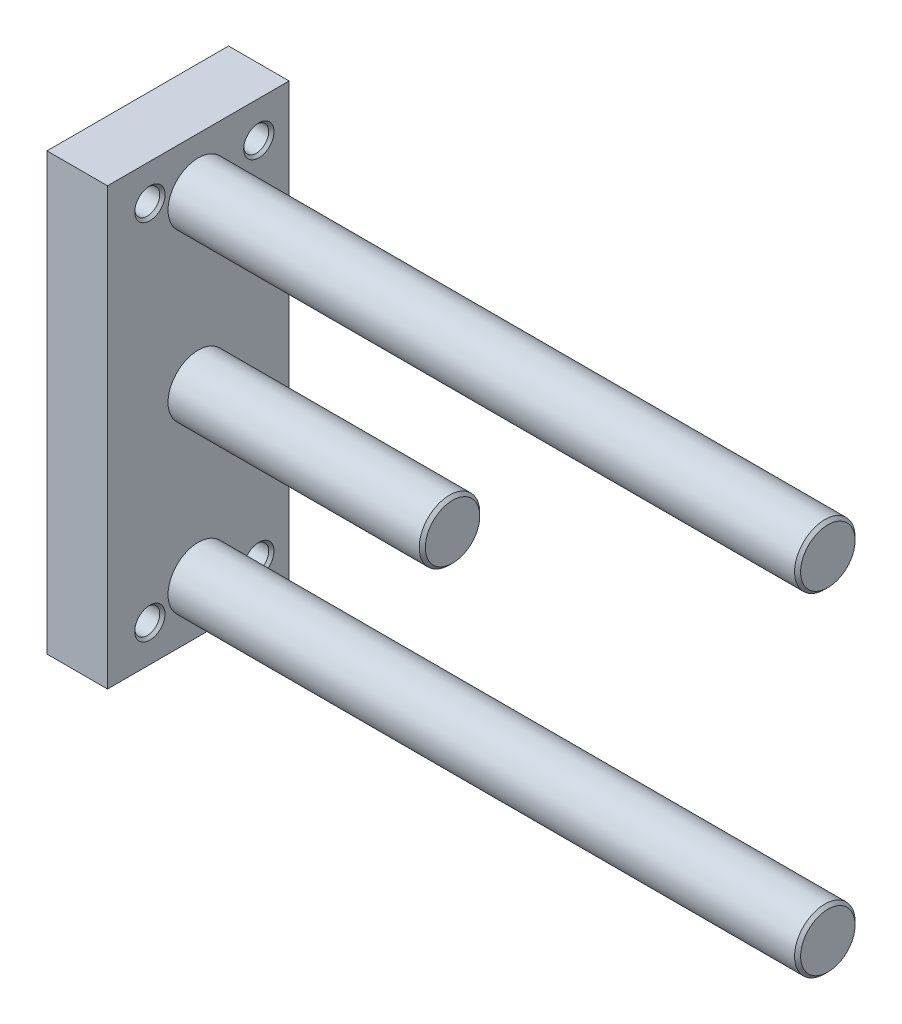
ISO-10303-21;
HEADER;
FILE_DESCRIPTION(('STEP AP214'),'2;1');
FILE_NAME('part.step','',(''),(''),'','','');
FILE_SCHEMA(('AUTOMOTIVE_DESIGN { 1 0 10303 214 1 1 1 1 }'));
ENDSEC;
DATA;
#1=APPLICATION_CONTEXT('core data for automotive mechanical design processes');
#2=APPLICATION_PROTOCOL_DEFINITION('international standard','automotive_design',2000,#1);
#3=PRODUCT_CONTEXT('',#1,'mechanical');
#4=PRODUCT('Part','Part','',(#3));
#5=PRODUCT_RELATED_PRODUCT_CATEGORY('part','',(#4));
#6=PRODUCT_DEFINITION_FORMATION('','',#4);
#7=PRODUCT_DEFINITION_CONTEXT('part definition',#1,'design');
#8=PRODUCT_DEFINITION('design','',#6,#7);
#9=PRODUCT_DEFINITION_SHAPE('','',#8);
#10=(LENGTH_UNIT() NAMED_UNIT(*) SI_UNIT(.MILLI.,.METRE.));
#11=(NAMED_UNIT(*) PLANE_ANGLE_UNIT() SI_UNIT($,.RADIAN.));
#12=(NAMED_UNIT(*) SI_UNIT($,.STERADIAN.) SOLID_ANGLE_UNIT());
#13=UNCERTAINTY_MEASURE_WITH_UNIT(LENGTH_MEASURE(1.E-05),#10,'distance_accuracy_value','');
#14=(GEOMETRIC_REPRESENTATION_CONTEXT(3) GLOBAL_UNCERTAINTY_ASSIGNED_CONTEXT((#13)) GLOBAL_UNIT_ASSIGNED_CONTEXT((#10,
#11,#12)) REPRESENTATION_CONTEXT('',''));
#15=CARTESIAN_POINT('',(0.,0.,0.));
#16=DIRECTION('',(0.,0.,1.));
#17=DIRECTION('',(1.,0.,0.));
#18=AXIS2_PLACEMENT_3D('',#15,#16,#17);
#19=CARTESIAN_POINT('',(10.,-36.,15.));
#20=DIRECTION('',(1.,0.,0.));
#21=DIRECTION('',(0.,0.,-1.));
#22=AXIS2_PLACEMENT_3D('',#19,#20,#21);
#23=PLANE('',#22);
#24=CARTESIAN_POINT('',(9.99999999999999,-27.5,0.));
#25=DIRECTION('',(-1.,0.,0.));
#26=DIRECTION('',(0.,0.,1.));
#27=AXIS2_PLACEMENT_3D('',#24,#25,#26);
#28=CIRCLE('',#27,5.);
#29=CARTESIAN_POINT('',(9.99999999999999,-27.5,5.));
#30=VERTEX_POINT('',#29);
#31=EDGE_CURVE('E200',#30,#30,#28,.T.);
#32=ORIENTED_EDGE('',*,*,#31,.T.);
#33=EDGE_LOOP('',(#32));
#34=FACE_BOUND('',#33,.T.);
#35=CARTESIAN_POINT('',(10.,-30.,-10.));
#36=DIRECTION('',(-1.,0.,0.));
#37=DIRECTION('',(0.,0.,1.));
#38=AXIS2_PLACEMENT_3D('',#35,#36,#37);
#39=CIRCLE('',#38,2.5);
#40=CARTESIAN_POINT('',(10.,-30.,-7.5));
#41=VERTEX_POINT('',#40);
#42=EDGE_CURVE('E271',#41,#41,#39,.T.);
#43=ORIENTED_EDGE('',*,*,#42,.T.);
#44=EDGE_LOOP('',(#43));
#45=FACE_BOUND('',#44,.T.);
#46=CARTESIAN_POINT('',(10.,30.,8.));
#47=DIRECTION('',(-1.,0.,0.));
#48=DIRECTION('',(0.,0.,1.));
#49=AXIS2_PLACEMENT_3D('',#46,#47,#48);
#50=CIRCLE('',#49,2.5);
#51=CARTESIAN_POINT('',(10.,30.,10.5));
#52=VERTEX_POINT('',#51);
#53=EDGE_CURVE('E293',#52,#52,#50,.T.);
#54=ORIENTED_EDGE('',*,*,#53,.T.);
#55=EDGE_LOOP('',(#54));
#56=FACE_BOUND('',#55,.T.);
#57=DIRECTION('',(0.,-1.,0.));
#58=VECTOR('',#57,1.);
#59=CARTESIAN_POINT('',(10.,36.,15.));
#60=LINE('',#59,#58);
#61=CARTESIAN_POINT('',(10.,36.,15.));
#62=VERTEX_POINT('',#61);
#63=CARTESIAN_POINT('',(10.,-36.,15.));
#64=VERTEX_POINT('',#63);
#65=EDGE_CURVE('E149',#62,#64,#60,.T.);
#66=ORIENTED_EDGE('',*,*,#65,.T.);
#67=DIRECTION('',(0.,0.,-1.));
#68=VECTOR('',#67,1.);
#69=CARTESIAN_POINT('',(10.,-36.,15.));
#70=LINE('',#69,#68);
#71=CARTESIAN_POINT('',(10.,-36.,-15.));
#72=VERTEX_POINT('',#71);
#73=EDGE_CURVE('E84',#64,#72,#70,.T.);
#74=ORIENTED_EDGE('',*,*,#73,.T.);
#75=DIRECTION('',(0.,1.,0.));
#76=VECTOR('',#75,1.);
#77=CARTESIAN_POINT('',(10.,-36.,-15.));
#78=LINE('',#77,#76);
#79=CARTESIAN_POINT('',(10.,36.,-15.));
#80=VERTEX_POINT('',#79);
#81=EDGE_CURVE('E145',#72,#80,#78,.T.);
#82=ORIENTED_EDGE('',*,*,#81,.T.);
#83=DIRECTION('',(0.,0.,1.));
#84=VECTOR('',#83,1.);
#85=CARTESIAN_POINT('',(10.,36.,-15.));
#86=LINE('',#85,#84);
#87=EDGE_CURVE('E53',#80,#62,#86,.T.);
#88=ORIENTED_EDGE('',*,*,#87,.T.);
#89=EDGE_LOOP('',(#66,#74,#82,#88));
#90=FACE_BOUND('',#89,.T.);
#91=CARTESIAN_POINT('',(10.,30.,-10.));
#92=DIRECTION('',(-1.,0.,0.));
#93=DIRECTION('',(0.,0.,1.));
#94=AXIS2_PLACEMENT_3D('',#91,#92,#93);
#95=CIRCLE('',#94,2.5);
#96=CARTESIAN_POINT('',(10.,30.,-7.5));
#97=VERTEX_POINT('',#96);
#98=EDGE_CURVE('E174',#97,#97,#95,.T.);
#99=ORIENTED_EDGE('',*,*,#98,.T.);
#100=EDGE_LOOP('',(#99));
#101=FACE_BOUND('',#100,.T.);
#102=CARTESIAN_POINT('',(10.,-30.,8.));
#103=DIRECTION('',(-1.,0.,0.));
#104=DIRECTION('',(0.,0.,1.));
#105=AXIS2_PLACEMENT_3D('',#102,#103,#104);
#106=CIRCLE('',#105,2.5);
#107=CARTESIAN_POINT('',(10.,-30.,10.5));
#108=VERTEX_POINT('',#107);
#109=EDGE_CURVE('E178',#108,#108,#106,.T.);
#110=ORIENTED_EDGE('',*,*,#109,.T.);
#111=EDGE_LOOP('',(#110));
#112=FACE_BOUND('',#111,.T.);
#113=CARTESIAN_POINT('',(10.,0.,0.));
#114=DIRECTION('',(-1.,0.,0.));
#115=DIRECTION('',(0.,0.,1.));
#116=AXIS2_PLACEMENT_3D('',#113,#114,#115);
#117=CIRCLE('',#116,5.);
#118=CARTESIAN_POINT('',(10.,0.,5.));
#119=VERTEX_POINT('',#118);
#120=EDGE_CURVE('E182',#119,#119,#117,.T.);
#121=ORIENTED_EDGE('',*,*,#120,.T.);
#122=EDGE_LOOP('',(#121));
#123=FACE_BOUND('',#122,.T.);
#124=CARTESIAN_POINT('',(9.99999999999999,27.5,0.));
#125=DIRECTION('',(-1.,0.,0.));
#126=DIRECTION('',(0.,0.,1.));
#127=AXIS2_PLACEMENT_3D('',#124,#125,#126);
#128=CIRCLE('',#127,5.);
#129=CARTESIAN_POINT('',(9.99999999999999,27.5,5.));
#130=VERTEX_POINT('',#129);
#131=EDGE_CURVE('E185',#130,#130,#128,.T.);
#132=ORIENTED_EDGE('',*,*,#131,.T.);
#133=EDGE_LOOP('',(#132));
#134=FACE_BOUND('',#133,.T.);
#135=ADVANCED_FACE('F36',(#34,#45,#56,#90,#101,#112,#123,#134),#23,.T.);
#136=CARTESIAN_POINT('',(0.,-36.,15.));
#137=DIRECTION('',(1.,0.,0.));
#138=DIRECTION('',(0.,0.,-1.));
#139=AXIS2_PLACEMENT_3D('',#136,#137,#138);
#140=PLANE('',#139);
#141=CARTESIAN_POINT('',(0.,0.,0.));
#142=DIRECTION('',(-1.,0.,0.));
#143=DIRECTION('',(0.,0.,1.));
#144=AXIS2_PLACEMENT_3D('',#141,#142,#143);
#145=CIRCLE('',#144,3.8);
#146=CARTESIAN_POINT('',(0.,0.,3.8));
#147=VERTEX_POINT('',#146);
#148=EDGE_CURVE('E247',#147,#147,#145,.T.);
#149=ORIENTED_EDGE('',*,*,#148,.F.);
#150=EDGE_LOOP('',(#149));
#151=FACE_BOUND('',#150,.T.);
#152=CARTESIAN_POINT('',(0.,-30.,-10.));
#153=DIRECTION('',(-1.,0.,0.));
#154=DIRECTION('',(0.,0.,1.));
#155=AXIS2_PLACEMENT_3D('',#152,#153,#154);
#156=CIRCLE('',#155,2.5);
#157=CARTESIAN_POINT('',(0.,-30.,-7.5));
#158=VERTEX_POINT('',#157);
#159=EDGE_CURVE('E280',#158,#158,#156,.T.);
#160=ORIENTED_EDGE('',*,*,#159,.F.);
#161=EDGE_LOOP('',(#160));
#162=FACE_BOUND('',#161,.T.);
#163=CARTESIAN_POINT('',(0.,30.,8.));
#164=DIRECTION('',(-1.,0.,0.));
#165=DIRECTION('',(0.,0.,1.));
#166=AXIS2_PLACEMENT_3D('',#163,#164,#165);
#167=CIRCLE('',#166,2.5);
#168=CARTESIAN_POINT('',(0.,30.,10.5));
#169=VERTEX_POINT('',#168);
#170=EDGE_CURVE('E302',#169,#169,#167,.T.);
#171=ORIENTED_EDGE('',*,*,#170,.F.);
#172=EDGE_LOOP('',(#171));
#173=FACE_BOUND('',#172,.T.);
#174=DIRECTION('',(0.,-1.,0.));
#175=VECTOR('',#174,1.);
#176=CARTESIAN_POINT('',(0.,36.,15.));
#177=LINE('',#176,#175);
#178=CARTESIAN_POINT('',(0.,36.,15.));
#179=VERTEX_POINT('',#178);
#180=CARTESIAN_POINT('',(0.,-36.,15.));
#181=VERTEX_POINT('',#180);
#182=EDGE_CURVE('E143',#179,#181,#177,.T.);
#183=ORIENTED_EDGE('',*,*,#182,.F.);
#184=DIRECTION('',(0.,0.,1.));
#185=VECTOR('',#184,1.);
#186=CARTESIAN_POINT('',(0.,36.,-15.));
#187=LINE('',#186,#185);
#188=CARTESIAN_POINT('',(0.,36.,-15.));
#189=VERTEX_POINT('',#188);
#190=EDGE_CURVE('E77',#189,#179,#187,.T.);
#191=ORIENTED_EDGE('',*,*,#190,.F.);
#192=DIRECTION('',(0.,1.,0.));
#193=VECTOR('',#192,1.);
#194=CARTESIAN_POINT('',(0.,-36.,-15.));
#195=LINE('',#194,#193);
#196=CARTESIAN_POINT('',(0.,-36.,-15.));
#197=VERTEX_POINT('',#196);
#198=EDGE_CURVE('E71',#197,#189,#195,.T.);
#199=ORIENTED_EDGE('',*,*,#198,.F.);
#200=DIRECTION('',(0.,0.,-1.));
#201=VECTOR('',#200,1.);
#202=CARTESIAN_POINT('',(0.,-36.,15.));
#203=LINE('',#202,#201);
#204=EDGE_CURVE('E137',#181,#197,#203,.T.);
#205=ORIENTED_EDGE('',*,*,#204,.F.);
#206=EDGE_LOOP('',(#183,#191,#199,#205));
#207=FACE_BOUND('',#206,.T.);
#208=CARTESIAN_POINT('',(0.,30.,-10.));
#209=DIRECTION('',(-1.,0.,0.));
#210=DIRECTION('',(0.,0.,1.));
#211=AXIS2_PLACEMENT_3D('',#208,#209,#210);
#212=CIRCLE('',#211,2.5);
#213=CARTESIAN_POINT('',(0.,30.,-7.5));
#214=VERTEX_POINT('',#213);
#215=EDGE_CURVE('E159',#214,#214,#212,.T.);
#216=ORIENTED_EDGE('',*,*,#215,.F.);
#217=EDGE_LOOP('',(#216));
#218=FACE_BOUND('',#217,.T.);
#219=CARTESIAN_POINT('',(0.,-30.,8.));
#220=DIRECTION('',(-1.,0.,0.));
#221=DIRECTION('',(0.,0.,1.));
#222=AXIS2_PLACEMENT_3D('',#219,#220,#221);
#223=CIRCLE('',#222,2.5);
#224=CARTESIAN_POINT('',(0.,-30.,10.5));
#225=VERTEX_POINT('',#224);
#226=EDGE_CURVE('E290',#225,#225,#223,.T.);
#227=ORIENTED_EDGE('',*,*,#226,.F.);
#228=EDGE_LOOP('',(#227));
#229=FACE_BOUND('',#228,.T.);
#230=CARTESIAN_POINT('',(0.,27.5,0.));
#231=DIRECTION('',(-1.,0.,0.));
#232=DIRECTION('',(0.,0.,1.));
#233=AXIS2_PLACEMENT_3D('',#230,#231,#232);
#234=CIRCLE('',#233,3.8);
#235=CARTESIAN_POINT('',(0.,27.5,3.8));
#236=VERTEX_POINT('',#235);
#237=EDGE_CURVE('E268',#236,#236,#234,.T.);
#238=ORIENTED_EDGE('',*,*,#237,.F.);
#239=EDGE_LOOP('',(#238));
#240=FACE_BOUND('',#239,.T.);
#241=CARTESIAN_POINT('',(0.,-27.5,0.));
#242=DIRECTION('',(-1.,0.,0.));
#243=DIRECTION('',(0.,0.,1.));
#244=AXIS2_PLACEMENT_3D('',#241,#242,#243);
#245=CIRCLE('',#244,3.8);
#246=CARTESIAN_POINT('',(0.,-27.5,3.8));
#247=VERTEX_POINT('',#246);
#248=EDGE_CURVE('E226',#247,#247,#245,.T.);
#249=ORIENTED_EDGE('',*,*,#248,.F.);
#250=EDGE_LOOP('',(#249));
#251=FACE_BOUND('',#250,.T.);
#252=ADVANCED_FACE('F112',(#151,#162,#173,#207,#218,#229,#240,#251),#140,.F.);
#253=CARTESIAN_POINT('',(10.,36.,15.));
#254=DIRECTION('',(0.,0.,-1.));
#255=DIRECTION('',(-1.,0.,0.));
#256=AXIS2_PLACEMENT_3D('',#253,#254,#255);
#257=PLANE('',#256);
#258=ORIENTED_EDGE('',*,*,#182,.T.);
#259=DIRECTION('',(-1.,0.,0.));
#260=VECTOR('',#259,1.);
#261=CARTESIAN_POINT('',(10.,-36.,15.));
#262=LINE('',#261,#260);
#263=EDGE_CURVE('E11',#64,#181,#262,.T.);
#264=ORIENTED_EDGE('',*,*,#263,.F.);
#265=ORIENTED_EDGE('',*,*,#65,.F.);
#266=DIRECTION('',(-1.,0.,0.));
#267=VECTOR('',#266,1.);
#268=CARTESIAN_POINT('',(10.,36.,15.));
#269=LINE('',#268,#267);
#270=EDGE_CURVE('E153',#62,#179,#269,.T.);
#271=ORIENTED_EDGE('',*,*,#270,.T.);
#272=EDGE_LOOP('',(#258,#264,#265,#271));
#273=FACE_BOUND('',#272,.T.);
#274=ADVANCED_FACE('F38',(#273),#257,.F.);
#275=CARTESIAN_POINT('',(10.,-36.,15.));
#276=DIRECTION('',(0.,1.,0.));
#277=DIRECTION('',(0.,0.,1.));
#278=AXIS2_PLACEMENT_3D('',#275,#276,#277);
#279=PLANE('',#278);
#280=ORIENTED_EDGE('',*,*,#204,.T.);
#281=DIRECTION('',(-1.,0.,0.));
#282=VECTOR('',#281,1.);
#283=CARTESIAN_POINT('',(10.,-36.,-15.));
#284=LINE('',#283,#282);
#285=EDGE_CURVE('E45',#72,#197,#284,.T.);
#286=ORIENTED_EDGE('',*,*,#285,.F.);
#287=ORIENTED_EDGE('',*,*,#73,.F.);
#288=ORIENTED_EDGE('',*,*,#263,.T.);
#289=EDGE_LOOP('',(#280,#286,#287,#288));
#290=FACE_BOUND('',#289,.T.);
#291=ADVANCED_FACE('F131',(#290),#279,.F.);
#292=CARTESIAN_POINT('',(10.,-36.,-15.));
#293=DIRECTION('',(0.,0.,1.));
#294=DIRECTION('',(1.,0.,0.));
#295=AXIS2_PLACEMENT_3D('',#292,#293,#294);
#296=PLANE('',#295);
#297=ORIENTED_EDGE('',*,*,#198,.T.);
#298=DIRECTION('',(-1.,0.,0.));
#299=VECTOR('',#298,1.);
#300=CARTESIAN_POINT('',(10.,36.,-15.));
#301=LINE('',#300,#299);
#302=EDGE_CURVE('E146',#80,#189,#301,.T.);
#303=ORIENTED_EDGE('',*,*,#302,.F.);
#304=ORIENTED_EDGE('',*,*,#81,.F.);
#305=ORIENTED_EDGE('',*,*,#285,.T.);
#306=EDGE_LOOP('',(#297,#303,#304,#305));
#307=FACE_BOUND('',#306,.T.);
#308=ADVANCED_FACE('F129',(#307),#296,.F.);
#309=CARTESIAN_POINT('',(10.,36.,-15.));
#310=DIRECTION('',(0.,-1.,0.));
#311=DIRECTION('',(0.,0.,-1.));
#312=AXIS2_PLACEMENT_3D('',#309,#310,#311);
#313=PLANE('',#312);
#314=ORIENTED_EDGE('',*,*,#190,.T.);
#315=ORIENTED_EDGE('',*,*,#270,.F.);
#316=ORIENTED_EDGE('',*,*,#87,.F.);
#317=ORIENTED_EDGE('',*,*,#302,.T.);
#318=EDGE_LOOP('',(#314,#315,#316,#317));
#319=FACE_BOUND('',#318,.T.);
#320=ADVANCED_FACE('F126',(#319),#313,.F.);
#321=CARTESIAN_POINT('',(0.432999999999999,30.,-10.));
#322=DIRECTION('',(-1.,0.,0.));
#323=DIRECTION('',(0.,0.,1.));
#324=AXIS2_PLACEMENT_3D('',#321,#322,#323);
#325=CONICAL_SURFACE('',#324,2.067,0.78539816339745);
#326=ORIENTED_EDGE('',*,*,#215,.T.);
#327=EDGE_LOOP('',(#326));
#328=FACE_BOUND('',#327,.T.);
#329=CARTESIAN_POINT('',(0.432999999999999,30.,-10.));
#330=DIRECTION('',(-1.,0.,0.));
#331=DIRECTION('',(0.,0.,1.));
#332=AXIS2_PLACEMENT_3D('',#329,#330,#331);
#333=CIRCLE('',#332,2.067);
#334=CARTESIAN_POINT('',(0.432999999999999,30.,-7.933));
#335=VERTEX_POINT('',#334);
#336=EDGE_CURVE('E161',#335,#335,#333,.T.);
#337=ORIENTED_EDGE('',*,*,#336,.F.);
#338=EDGE_LOOP('',(#337));
#339=FACE_BOUND('',#338,.T.);
#340=ADVANCED_FACE('F123',(#328,#339),#325,.F.);
#341=CARTESIAN_POINT('',(10.,30.,-10.));
#342=DIRECTION('',(-1.,0.,0.));
#343=DIRECTION('',(0.,0.,1.));
#344=AXIS2_PLACEMENT_3D('',#341,#342,#343);
#345=CYLINDRICAL_SURFACE('',#344,2.067);
#346=ORIENTED_EDGE('',*,*,#336,.T.);
#347=EDGE_LOOP('',(#346));
#348=FACE_BOUND('',#347,.T.);
#349=CARTESIAN_POINT('',(9.567,30.,-10.));
#350=DIRECTION('',(-1.,0.,0.));
#351=DIRECTION('',(0.,0.,1.));
#352=AXIS2_PLACEMENT_3D('',#349,#350,#351);
#353=CIRCLE('',#352,2.067);
#354=CARTESIAN_POINT('',(9.567,30.,-7.933));
#355=VERTEX_POINT('',#354);
#356=EDGE_CURVE('E166',#355,#355,#353,.T.);
#357=ORIENTED_EDGE('',*,*,#356,.F.);
#358=EDGE_LOOP('',(#357));
#359=FACE_BOUND('',#358,.T.);
#360=ADVANCED_FACE('F311',(#348,#359),#345,.F.);
#361=CARTESIAN_POINT('',(10.,30.,-10.));
#362=DIRECTION('',(1.,0.,0.));
#363=DIRECTION('',(0.,0.,-1.));
#364=AXIS2_PLACEMENT_3D('',#361,#362,#363);
#365=CONICAL_SURFACE('',#364,2.5,0.78539816339745);
#366=ORIENTED_EDGE('',*,*,#356,.T.);
#367=EDGE_LOOP('',(#366));
#368=FACE_BOUND('',#367,.T.);
#369=ORIENTED_EDGE('',*,*,#98,.F.);
#370=EDGE_LOOP('',(#369));
#371=FACE_BOUND('',#370,.T.);
#372=ADVANCED_FACE('F308',(#368,#371),#365,.F.);
#373=CARTESIAN_POINT('',(0.432999999999999,30.,8.));
#374=DIRECTION('',(-1.,0.,0.));
#375=DIRECTION('',(0.,0.,1.));
#376=AXIS2_PLACEMENT_3D('',#373,#374,#375);
#377=CONICAL_SURFACE('',#376,2.067,0.78539816339745);
#378=ORIENTED_EDGE('',*,*,#170,.T.);
#379=EDGE_LOOP('',(#378));
#380=FACE_BOUND('',#379,.T.);
#381=CARTESIAN_POINT('',(0.432999999999999,30.,8.));
#382=DIRECTION('',(-1.,0.,0.));
#383=DIRECTION('',(0.,0.,1.));
#384=AXIS2_PLACEMENT_3D('',#381,#382,#383);
#385=CIRCLE('',#384,2.067);
#386=CARTESIAN_POINT('',(0.432999999999999,30.,10.067));
#387=VERTEX_POINT('',#386);
#388=EDGE_CURVE('E299',#387,#387,#385,.T.);
#389=ORIENTED_EDGE('',*,*,#388,.F.);
#390=EDGE_LOOP('',(#389));
#391=FACE_BOUND('',#390,.T.);
#392=ADVANCED_FACE('F318',(#380,#391),#377,.F.);
#393=CARTESIAN_POINT('',(10.,30.,8.));
#394=DIRECTION('',(-1.,0.,0.));
#395=DIRECTION('',(0.,0.,1.));
#396=AXIS2_PLACEMENT_3D('',#393,#394,#395);
#397=CYLINDRICAL_SURFACE('',#396,2.067);
#398=ORIENTED_EDGE('',*,*,#388,.T.);
#399=EDGE_LOOP('',(#398));
#400=FACE_BOUND('',#399,.T.);
#401=CARTESIAN_POINT('',(9.567,30.,8.));
#402=DIRECTION('',(-1.,0.,0.));
#403=DIRECTION('',(0.,0.,1.));
#404=AXIS2_PLACEMENT_3D('',#401,#402,#403);
#405=CIRCLE('',#404,2.067);
#406=CARTESIAN_POINT('',(9.567,30.,10.067));
#407=VERTEX_POINT('',#406);
#408=EDGE_CURVE('E296',#407,#407,#405,.T.);
#409=ORIENTED_EDGE('',*,*,#408,.F.);
#410=EDGE_LOOP('',(#409));
#411=FACE_BOUND('',#410,.T.);
#412=ADVANCED_FACE('F323',(#400,#411),#397,.F.);
#413=CARTESIAN_POINT('',(10.,30.,8.));
#414=DIRECTION('',(1.,0.,0.));
#415=DIRECTION('',(0.,0.,-1.));
#416=AXIS2_PLACEMENT_3D('',#413,#414,#415);
#417=CONICAL_SURFACE('',#416,2.5,0.78539816339745);
#418=ORIENTED_EDGE('',*,*,#408,.T.);
#419=EDGE_LOOP('',(#418));
#420=FACE_BOUND('',#419,.T.);
#421=ORIENTED_EDGE('',*,*,#53,.F.);
#422=EDGE_LOOP('',(#421));
#423=FACE_BOUND('',#422,.T.);
#424=ADVANCED_FACE('F327',(#420,#423),#417,.F.);
#425=CARTESIAN_POINT('',(0.432999999999999,-30.,8.));
#426=DIRECTION('',(-1.,0.,0.));
#427=DIRECTION('',(0.,0.,1.));
#428=AXIS2_PLACEMENT_3D('',#425,#426,#427);
#429=CONICAL_SURFACE('',#428,2.067,0.78539816339745);
#430=ORIENTED_EDGE('',*,*,#226,.T.);
#431=EDGE_LOOP('',(#430));
#432=FACE_BOUND('',#431,.T.);
#433=CARTESIAN_POINT('',(0.432999999999999,-30.,8.));
#434=DIRECTION('',(-1.,0.,0.));
#435=DIRECTION('',(0.,0.,1.));
#436=AXIS2_PLACEMENT_3D('',#433,#434,#435);
#437=CIRCLE('',#436,2.067);
#438=CARTESIAN_POINT('',(0.432999999999999,-30.,10.067));
#439=VERTEX_POINT('',#438);
#440=EDGE_CURVE('E287',#439,#439,#437,.T.);
#441=ORIENTED_EDGE('',*,*,#440,.F.);
#442=EDGE_LOOP('',(#441));
#443=FACE_BOUND('',#442,.T.);
#444=ADVANCED_FACE('F331',(#432,#443),#429,.F.);
#445=CARTESIAN_POINT('',(10.,-30.,8.));
#446=DIRECTION('',(-1.,0.,0.));
#447=DIRECTION('',(0.,0.,1.));
#448=AXIS2_PLACEMENT_3D('',#445,#446,#447);
#449=CYLINDRICAL_SURFACE('',#448,2.067);
#450=ORIENTED_EDGE('',*,*,#440,.T.);
#451=EDGE_LOOP('',(#450));
#452=FACE_BOUND('',#451,.T.);
#453=CARTESIAN_POINT('',(9.567,-30.,8.));
#454=DIRECTION('',(-1.,0.,0.));
#455=DIRECTION('',(0.,0.,1.));
#456=AXIS2_PLACEMENT_3D('',#453,#454,#455);
#457=CIRCLE('',#456,2.067);
#458=CARTESIAN_POINT('',(9.567,-30.,10.067));
#459=VERTEX_POINT('',#458);
#460=EDGE_CURVE('E284',#459,#459,#457,.T.);
#461=ORIENTED_EDGE('',*,*,#460,.F.);
#462=EDGE_LOOP('',(#461));
#463=FACE_BOUND('',#462,.T.);
#464=ADVANCED_FACE('F335',(#452,#463),#449,.F.);
#465=CARTESIAN_POINT('',(10.,-30.,8.));
#466=DIRECTION('',(1.,0.,0.));
#467=DIRECTION('',(0.,0.,-1.));
#468=AXIS2_PLACEMENT_3D('',#465,#466,#467);
#469=CONICAL_SURFACE('',#468,2.5,0.78539816339745);
#470=ORIENTED_EDGE('',*,*,#460,.T.);
#471=EDGE_LOOP('',(#470));
#472=FACE_BOUND('',#471,.T.);
#473=ORIENTED_EDGE('',*,*,#109,.F.);
#474=EDGE_LOOP('',(#473));
#475=FACE_BOUND('',#474,.T.);
#476=ADVANCED_FACE('F339',(#472,#475),#469,.F.);
#477=CARTESIAN_POINT('',(0.432999999999999,-30.,-10.));
#478=DIRECTION('',(-1.,0.,0.));
#479=DIRECTION('',(0.,0.,1.));
#480=AXIS2_PLACEMENT_3D('',#477,#478,#479);
#481=CONICAL_SURFACE('',#480,2.067,0.78539816339745);
#482=ORIENTED_EDGE('',*,*,#159,.T.);
#483=EDGE_LOOP('',(#482));
#484=FACE_BOUND('',#483,.T.);
#485=CARTESIAN_POINT('',(0.432999999999999,-30.,-10.));
#486=DIRECTION('',(-1.,0.,0.));
#487=DIRECTION('',(0.,0.,1.));
#488=AXIS2_PLACEMENT_3D('',#485,#486,#487);
#489=CIRCLE('',#488,2.067);
#490=CARTESIAN_POINT('',(0.432999999999999,-30.,-7.933));
#491=VERTEX_POINT('',#490);
#492=EDGE_CURVE('E277',#491,#491,#489,.T.);
#493=ORIENTED_EDGE('',*,*,#492,.F.);
#494=EDGE_LOOP('',(#493));
#495=FACE_BOUND('',#494,.T.);
#496=ADVANCED_FACE('F343',(#484,#495),#481,.F.);
#497=CARTESIAN_POINT('',(10.,-30.,-10.));
#498=DIRECTION('',(-1.,0.,0.));
#499=DIRECTION('',(0.,0.,1.));
#500=AXIS2_PLACEMENT_3D('',#497,#498,#499);
#501=CYLINDRICAL_SURFACE('',#500,2.067);
#502=ORIENTED_EDGE('',*,*,#492,.T.);
#503=EDGE_LOOP('',(#502));
#504=FACE_BOUND('',#503,.T.);
#505=CARTESIAN_POINT('',(9.567,-30.,-10.));
#506=DIRECTION('',(-1.,0.,0.));
#507=DIRECTION('',(0.,0.,1.));
#508=AXIS2_PLACEMENT_3D('',#505,#506,#507);
#509=CIRCLE('',#508,2.067);
#510=CARTESIAN_POINT('',(9.567,-30.,-7.933));
#511=VERTEX_POINT('',#510);
#512=EDGE_CURVE('E274',#511,#511,#509,.T.);
#513=ORIENTED_EDGE('',*,*,#512,.F.);
#514=EDGE_LOOP('',(#513));
#515=FACE_BOUND('',#514,.T.);
#516=ADVANCED_FACE('F347',(#504,#515),#501,.F.);
#517=CARTESIAN_POINT('',(10.,-30.,-10.));
#518=DIRECTION('',(1.,0.,0.));
#519=DIRECTION('',(0.,0.,-1.));
#520=AXIS2_PLACEMENT_3D('',#517,#518,#519);
#521=CONICAL_SURFACE('',#520,2.5,0.78539816339745);
#522=ORIENTED_EDGE('',*,*,#512,.T.);
#523=EDGE_LOOP('',(#522));
#524=FACE_BOUND('',#523,.T.);
#525=ORIENTED_EDGE('',*,*,#42,.F.);
#526=EDGE_LOOP('',(#525));
#527=FACE_BOUND('',#526,.T.);
#528=ADVANCED_FACE('F351',(#524,#527),#521,.F.);
#529=CARTESIAN_POINT('',(5.02158095934,27.5,0.));
#530=DIRECTION('',(-1.,0.,0.));
#531=DIRECTION('',(0.,0.,1.));
#532=AXIS2_PLACEMENT_3D('',#529,#530,#531);
#533=CYLINDRICAL_SURFACE('',#532,3.8);
#534=ORIENTED_EDGE('',*,*,#237,.T.);
#535=EDGE_LOOP('',(#534));
#536=FACE_BOUND('',#535,.T.);
#537=CARTESIAN_POINT('',(5.5555555555556,27.5,0.));
#538=DIRECTION('',(-1.,0.,0.));
#539=DIRECTION('',(0.,0.,1.));
#540=AXIS2_PLACEMENT_3D('',#537,#538,#539);
#541=CIRCLE('',#540,3.8);
#542=CARTESIAN_POINT('',(5.5555555555556,27.5,3.8));
#543=VERTEX_POINT('',#542);
#544=EDGE_CURVE('E265',#543,#543,#541,.T.);
#545=ORIENTED_EDGE('',*,*,#544,.F.);
#546=EDGE_LOOP('',(#545));
#547=FACE_BOUND('',#546,.T.);
#548=ADVANCED_FACE('F355',(#536,#547),#533,.F.);
#549=CARTESIAN_POINT('',(5.5555555555556,27.5,-3.8));
#550=DIRECTION('',(-1.,0.,0.));
#551=DIRECTION('',(0.,0.,1.));
#552=AXIS2_PLACEMENT_3D('',#549,#550,#551);
#553=PLANE('',#552);
#554=ORIENTED_EDGE('',*,*,#544,.T.);
#555=EDGE_LOOP('',(#554));
#556=FACE_BOUND('',#555,.T.);
#557=CARTESIAN_POINT('',(5.5555555555556,27.5,0.));
#558=DIRECTION('',(-1.,0.,0.));
#559=DIRECTION('',(0.,0.,1.));
#560=AXIS2_PLACEMENT_3D('',#557,#558,#559);
#561=CIRCLE('',#560,3.5);
#562=CARTESIAN_POINT('',(5.5555555555556,27.5,3.5));
#563=VERTEX_POINT('',#562);
#564=EDGE_CURVE('E262',#563,#563,#561,.T.);
#565=ORIENTED_EDGE('',*,*,#564,.F.);
#566=EDGE_LOOP('',(#565));
#567=FACE_BOUND('',#566,.T.);
#568=ADVANCED_FACE('F359',(#556,#567),#553,.T.);
#569=CARTESIAN_POINT('',(5.02158095934,27.5,0.));
#570=DIRECTION('',(-1.,0.,0.));
#571=DIRECTION('',(0.,0.,1.));
#572=AXIS2_PLACEMENT_3D('',#569,#570,#571);
#573=CYLINDRICAL_SURFACE('',#572,3.5);
#574=ORIENTED_EDGE('',*,*,#564,.T.);
#575=EDGE_LOOP('',(#574));
#576=FACE_BOUND('',#575,.T.);
#577=CARTESIAN_POINT('',(2.0555555555556,27.5,0.));
#578=DIRECTION('',(-1.,0.,0.));
#579=DIRECTION('',(0.,0.,1.));
#580=AXIS2_PLACEMENT_3D('',#577,#578,#579);
#581=CIRCLE('',#580,3.5);
#582=CARTESIAN_POINT('',(2.0555555555556,27.5,3.5));
#583=VERTEX_POINT('',#582);
#584=EDGE_CURVE('E259',#583,#583,#581,.T.);
#585=ORIENTED_EDGE('',*,*,#584,.F.);
#586=EDGE_LOOP('',(#585));
#587=FACE_BOUND('',#586,.T.);
#588=ADVANCED_FACE('F363',(#576,#587),#573,.T.);
#589=CARTESIAN_POINT('',(1.5555555555556,27.5,0.));
#590=DIRECTION('',(1.,0.,0.));
#591=DIRECTION('',(0.,0.,-1.));
#592=AXIS2_PLACEMENT_3D('',#589,#590,#591);
#593=CONICAL_SURFACE('',#592,3.,0.785398163397448);
#594=ORIENTED_EDGE('',*,*,#584,.T.);
#595=EDGE_LOOP('',(#594));
#596=FACE_BOUND('',#595,.T.);
#597=CARTESIAN_POINT('',(1.5555555555556,27.5,0.));
#598=DIRECTION('',(-1.,0.,0.));
#599=DIRECTION('',(0.,0.,1.));
#600=AXIS2_PLACEMENT_3D('',#597,#598,#599);
#601=CIRCLE('',#600,3.);
#602=CARTESIAN_POINT('',(1.5555555555556,27.5,3.));
#603=VERTEX_POINT('',#602);
#604=EDGE_CURVE('E256',#603,#603,#601,.T.);
#605=ORIENTED_EDGE('',*,*,#604,.F.);
#606=EDGE_LOOP('',(#605));
#607=FACE_BOUND('',#606,.T.);
#608=ADVANCED_FACE('F367',(#596,#607),#593,.T.);
#609=CARTESIAN_POINT('',(1.5555555555556,27.5,-3.));
#610=DIRECTION('',(-1.,0.,0.));
#611=DIRECTION('',(0.,0.,1.));
#612=AXIS2_PLACEMENT_3D('',#609,#610,#611);
#613=PLANE('',#612);
#614=ORIENTED_EDGE('',*,*,#604,.T.);
#615=EDGE_LOOP('',(#614));
#616=FACE_BOUND('',#615,.T.);
#617=CARTESIAN_POINT('',(1.5555555555556,27.5,0.));
#618=DIRECTION('',(-1.,0.,0.));
#619=DIRECTION('',(0.,0.,1.));
#620=AXIS2_PLACEMENT_3D('',#617,#618,#619);
#621=CIRCLE('',#620,1.5);
#622=CARTESIAN_POINT('',(1.5555555555556,27.5,1.5));
#623=VERTEX_POINT('',#622);
#624=EDGE_CURVE('E253',#623,#623,#621,.T.);
#625=ORIENTED_EDGE('',*,*,#624,.F.);
#626=EDGE_LOOP('',(#625));
#627=FACE_BOUND('',#626,.T.);
#628=ADVANCED_FACE('F371',(#616,#627),#613,.T.);
#629=CARTESIAN_POINT('',(5.02158095934,27.5,0.));
#630=DIRECTION('',(-1.,0.,0.));
#631=DIRECTION('',(0.,0.,1.));
#632=AXIS2_PLACEMENT_3D('',#629,#630,#631);
#633=CYLINDRICAL_SURFACE('',#632,1.5);
#634=ORIENTED_EDGE('',*,*,#624,.T.);
#635=EDGE_LOOP('',(#634));
#636=FACE_BOUND('',#635,.T.);
#637=CARTESIAN_POINT('',(4.1555555555556,27.5,0.));
#638=DIRECTION('',(-1.,0.,0.));
#639=DIRECTION('',(0.,0.,1.));
#640=AXIS2_PLACEMENT_3D('',#637,#638,#639);
#641=CIRCLE('',#640,1.5);
#642=CARTESIAN_POINT('',(4.1555555555556,27.5,1.5));
#643=VERTEX_POINT('',#642);
#644=EDGE_CURVE('E250',#643,#643,#641,.T.);
#645=ORIENTED_EDGE('',*,*,#644,.F.);
#646=EDGE_LOOP('',(#645));
#647=FACE_BOUND('',#646,.T.);
#648=ADVANCED_FACE('F375',(#636,#647),#633,.F.);
#649=CARTESIAN_POINT('',(5.02158095934,27.5,0.));
#650=DIRECTION('',(-1.,0.,0.));
#651=DIRECTION('',(0.,0.,1.));
#652=AXIS2_PLACEMENT_3D('',#649,#650,#651);
#653=CONICAL_SURFACE('',#652,0.,1.04719755119662);
#654=ORIENTED_EDGE('',*,*,#644,.T.);
#655=EDGE_LOOP('',(#654));
#656=FACE_BOUND('',#655,.T.);
#657=CARTESIAN_POINT('',(5.02158095934,27.5,0.));
#658=VERTEX_POINT('',#657);
#659=VERTEX_LOOP('',#658);
#660=FACE_BOUND('',#659,.T.);
#661=ADVANCED_FACE('F379',(#656,#660),#653,.F.);
#662=CARTESIAN_POINT('',(5.02158095934,0.,0.));
#663=DIRECTION('',(-1.,0.,0.));
#664=DIRECTION('',(0.,0.,1.));
#665=AXIS2_PLACEMENT_3D('',#662,#663,#664);
#666=CYLINDRICAL_SURFACE('',#665,3.8);
#667=ORIENTED_EDGE('',*,*,#148,.T.);
#668=EDGE_LOOP('',(#667));
#669=FACE_BOUND('',#668,.T.);
#670=CARTESIAN_POINT('',(5.5555555555556,0.,0.));
#671=DIRECTION('',(-1.,0.,0.));
#672=DIRECTION('',(0.,0.,1.));
#673=AXIS2_PLACEMENT_3D('',#670,#671,#672);
#674=CIRCLE('',#673,3.8);
#675=CARTESIAN_POINT('',(5.5555555555556,0.,3.8));
#676=VERTEX_POINT('',#675);
#677=EDGE_CURVE('E244',#676,#676,#674,.T.);
#678=ORIENTED_EDGE('',*,*,#677,.F.);
#679=EDGE_LOOP('',(#678));
#680=FACE_BOUND('',#679,.T.);
#681=ADVANCED_FACE('F383',(#669,#680),#666,.F.);
#682=CARTESIAN_POINT('',(5.5555555555556,0.,-3.8));
#683=DIRECTION('',(-1.,0.,0.));
#684=DIRECTION('',(0.,0.,1.));
#685=AXIS2_PLACEMENT_3D('',#682,#683,#684);
#686=PLANE('',#685);
#687=ORIENTED_EDGE('',*,*,#677,.T.);
#688=EDGE_LOOP('',(#687));
#689=FACE_BOUND('',#688,.T.);
#690=CARTESIAN_POINT('',(5.5555555555556,0.,0.));
#691=DIRECTION('',(-1.,0.,0.));
#692=DIRECTION('',(0.,0.,1.));
#693=AXIS2_PLACEMENT_3D('',#690,#691,#692);
#694=CIRCLE('',#693,3.5);
#695=CARTESIAN_POINT('',(5.5555555555556,0.,3.5));
#696=VERTEX_POINT('',#695);
#697=EDGE_CURVE('E241',#696,#696,#694,.T.);
#698=ORIENTED_EDGE('',*,*,#697,.F.);
#699=EDGE_LOOP('',(#698));
#700=FACE_BOUND('',#699,.T.);
#701=ADVANCED_FACE('F387',(#689,#700),#686,.T.);
#702=CARTESIAN_POINT('',(5.02158095934,0.,0.));
#703=DIRECTION('',(-1.,0.,0.));
#704=DIRECTION('',(0.,0.,1.));
#705=AXIS2_PLACEMENT_3D('',#702,#703,#704);
#706=CYLINDRICAL_SURFACE('',#705,3.5);
#707=ORIENTED_EDGE('',*,*,#697,.T.);
#708=EDGE_LOOP('',(#707));
#709=FACE_BOUND('',#708,.T.);
#710=CARTESIAN_POINT('',(2.0555555555556,0.,0.));
#711=DIRECTION('',(-1.,0.,0.));
#712=DIRECTION('',(0.,0.,1.));
#713=AXIS2_PLACEMENT_3D('',#710,#711,#712);
#714=CIRCLE('',#713,3.5);
#715=CARTESIAN_POINT('',(2.0555555555556,0.,3.5));
#716=VERTEX_POINT('',#715);
#717=EDGE_CURVE('E238',#716,#716,#714,.T.);
#718=ORIENTED_EDGE('',*,*,#717,.F.);
#719=EDGE_LOOP('',(#718));
#720=FACE_BOUND('',#719,.T.);
#721=ADVANCED_FACE('F391',(#709,#720),#706,.T.);
#722=CARTESIAN_POINT('',(1.5555555555556,0.,0.));
#723=DIRECTION('',(1.,0.,0.));
#724=DIRECTION('',(0.,0.,-1.));
#725=AXIS2_PLACEMENT_3D('',#722,#723,#724);
#726=CONICAL_SURFACE('',#725,3.,0.785398163397448);
#727=ORIENTED_EDGE('',*,*,#717,.T.);
#728=EDGE_LOOP('',(#727));
#729=FACE_BOUND('',#728,.T.);
#730=CARTESIAN_POINT('',(1.5555555555556,0.,0.));
#731=DIRECTION('',(-1.,0.,0.));
#732=DIRECTION('',(0.,0.,1.));
#733=AXIS2_PLACEMENT_3D('',#730,#731,#732);
#734=CIRCLE('',#733,3.);
#735=CARTESIAN_POINT('',(1.5555555555556,0.,3.));
#736=VERTEX_POINT('',#735);
#737=EDGE_CURVE('E235',#736,#736,#734,.T.);
#738=ORIENTED_EDGE('',*,*,#737,.F.);
#739=EDGE_LOOP('',(#738));
#740=FACE_BOUND('',#739,.T.);
#741=ADVANCED_FACE('F395',(#729,#740),#726,.T.);
#742=CARTESIAN_POINT('',(1.5555555555556,0.,-3.));
#743=DIRECTION('',(-1.,0.,0.));
#744=DIRECTION('',(0.,0.,1.));
#745=AXIS2_PLACEMENT_3D('',#742,#743,#744);
#746=PLANE('',#745);
#747=ORIENTED_EDGE('',*,*,#737,.T.);
#748=EDGE_LOOP('',(#747));
#749=FACE_BOUND('',#748,.T.);
#750=CARTESIAN_POINT('',(1.5555555555556,0.,0.));
#751=DIRECTION('',(-1.,0.,0.));
#752=DIRECTION('',(0.,0.,1.));
#753=AXIS2_PLACEMENT_3D('',#750,#751,#752);
#754=CIRCLE('',#753,1.5);
#755=CARTESIAN_POINT('',(1.5555555555556,0.,1.5));
#756=VERTEX_POINT('',#755);
#757=EDGE_CURVE('E232',#756,#756,#754,.T.);
#758=ORIENTED_EDGE('',*,*,#757,.F.);
#759=EDGE_LOOP('',(#758));
#760=FACE_BOUND('',#759,.T.);
#761=ADVANCED_FACE('F399',(#749,#760),#746,.T.);
#762=CARTESIAN_POINT('',(5.02158095934,0.,0.));
#763=DIRECTION('',(-1.,0.,0.));
#764=DIRECTION('',(0.,0.,1.));
#765=AXIS2_PLACEMENT_3D('',#762,#763,#764);
#766=CYLINDRICAL_SURFACE('',#765,1.5);
#767=ORIENTED_EDGE('',*,*,#757,.T.);
#768=EDGE_LOOP('',(#767));
#769=FACE_BOUND('',#768,.T.);
#770=CARTESIAN_POINT('',(4.1555555555556,0.,0.));
#771=DIRECTION('',(-1.,0.,0.));
#772=DIRECTION('',(0.,0.,1.));
#773=AXIS2_PLACEMENT_3D('',#770,#771,#772);
#774=CIRCLE('',#773,1.5);
#775=CARTESIAN_POINT('',(4.1555555555556,0.,1.5));
#776=VERTEX_POINT('',#775);
#777=EDGE_CURVE('E229',#776,#776,#774,.T.);
#778=ORIENTED_EDGE('',*,*,#777,.F.);
#779=EDGE_LOOP('',(#778));
#780=FACE_BOUND('',#779,.T.);
#781=ADVANCED_FACE('F403',(#769,#780),#766,.F.);
#782=CARTESIAN_POINT('',(5.02158095934,0.,0.));
#783=DIRECTION('',(-1.,0.,0.));
#784=DIRECTION('',(0.,0.,1.));
#785=AXIS2_PLACEMENT_3D('',#782,#783,#784);
#786=CONICAL_SURFACE('',#785,0.,1.04719755119662);
#787=ORIENTED_EDGE('',*,*,#777,.T.);
#788=EDGE_LOOP('',(#787));
#789=FACE_BOUND('',#788,.T.);
#790=CARTESIAN_POINT('',(5.02158095934,0.,0.));
#791=VERTEX_POINT('',#790);
#792=VERTEX_LOOP('',#791);
#793=FACE_BOUND('',#792,.T.);
#794=ADVANCED_FACE('F407',(#789,#793),#786,.F.);
#795=CARTESIAN_POINT('',(5.02158095934,-27.5,0.));
#796=DIRECTION('',(-1.,0.,0.));
#797=DIRECTION('',(0.,0.,1.));
#798=AXIS2_PLACEMENT_3D('',#795,#796,#797);
#799=CYLINDRICAL_SURFACE('',#798,3.8);
#800=ORIENTED_EDGE('',*,*,#248,.T.);
#801=EDGE_LOOP('',(#800));
#802=FACE_BOUND('',#801,.T.);
#803=CARTESIAN_POINT('',(5.5555555555556,-27.5,0.));
#804=DIRECTION('',(-1.,0.,0.));
#805=DIRECTION('',(0.,0.,1.));
#806=AXIS2_PLACEMENT_3D('',#803,#804,#805);
#807=CIRCLE('',#806,3.8);
#808=CARTESIAN_POINT('',(5.5555555555556,-27.5,3.8));
#809=VERTEX_POINT('',#808);
#810=EDGE_CURVE('E223',#809,#809,#807,.T.);
#811=ORIENTED_EDGE('',*,*,#810,.F.);
#812=EDGE_LOOP('',(#811));
#813=FACE_BOUND('',#812,.T.);
#814=ADVANCED_FACE('F411',(#802,#813),#799,.F.);
#815=CARTESIAN_POINT('',(5.5555555555556,-27.5,-3.8));
#816=DIRECTION('',(-1.,0.,0.));
#817=DIRECTION('',(0.,0.,1.));
#818=AXIS2_PLACEMENT_3D('',#815,#816,#817);
#819=PLANE('',#818);
#820=ORIENTED_EDGE('',*,*,#810,.T.);
#821=EDGE_LOOP('',(#820));
#822=FACE_BOUND('',#821,.T.);
#823=CARTESIAN_POINT('',(5.5555555555556,-27.5,0.));
#824=DIRECTION('',(-1.,0.,0.));
#825=DIRECTION('',(0.,0.,1.));
#826=AXIS2_PLACEMENT_3D('',#823,#824,#825);
#827=CIRCLE('',#826,3.5);
#828=CARTESIAN_POINT('',(5.5555555555556,-27.5,3.5));
#829=VERTEX_POINT('',#828);
#830=EDGE_CURVE('E220',#829,#829,#827,.T.);
#831=ORIENTED_EDGE('',*,*,#830,.F.);
#832=EDGE_LOOP('',(#831));
#833=FACE_BOUND('',#832,.T.);
#834=ADVANCED_FACE('F415',(#822,#833),#819,.T.);
#835=CARTESIAN_POINT('',(5.02158095934,-27.5,0.));
#836=DIRECTION('',(-1.,0.,0.));
#837=DIRECTION('',(0.,0.,1.));
#838=AXIS2_PLACEMENT_3D('',#835,#836,#837);
#839=CYLINDRICAL_SURFACE('',#838,3.5);
#840=ORIENTED_EDGE('',*,*,#830,.T.);
#841=EDGE_LOOP('',(#840));
#842=FACE_BOUND('',#841,.T.);
#843=CARTESIAN_POINT('',(2.0555555555556,-27.5,0.));
#844=DIRECTION('',(-1.,0.,0.));
#845=DIRECTION('',(0.,0.,1.));
#846=AXIS2_PLACEMENT_3D('',#843,#844,#845);
#847=CIRCLE('',#846,3.5);
#848=CARTESIAN_POINT('',(2.0555555555556,-27.5,3.5));
#849=VERTEX_POINT('',#848);
#850=EDGE_CURVE('E217',#849,#849,#847,.T.);
#851=ORIENTED_EDGE('',*,*,#850,.F.);
#852=EDGE_LOOP('',(#851));
#853=FACE_BOUND('',#852,.T.);
#854=ADVANCED_FACE('F419',(#842,#853),#839,.T.);
#855=CARTESIAN_POINT('',(1.5555555555556,-27.5,0.));
#856=DIRECTION('',(1.,0.,0.));
#857=DIRECTION('',(0.,0.,-1.));
#858=AXIS2_PLACEMENT_3D('',#855,#856,#857);
#859=CONICAL_SURFACE('',#858,3.,0.785398163397448);
#860=ORIENTED_EDGE('',*,*,#850,.T.);
#861=EDGE_LOOP('',(#860));
#862=FACE_BOUND('',#861,.T.);
#863=CARTESIAN_POINT('',(1.5555555555556,-27.5,0.));
#864=DIRECTION('',(-1.,0.,0.));
#865=DIRECTION('',(0.,0.,1.));
#866=AXIS2_PLACEMENT_3D('',#863,#864,#865);
#867=CIRCLE('',#866,3.);
#868=CARTESIAN_POINT('',(1.5555555555556,-27.5,3.));
#869=VERTEX_POINT('',#868);
#870=EDGE_CURVE('E214',#869,#869,#867,.T.);
#871=ORIENTED_EDGE('',*,*,#870,.F.);
#872=EDGE_LOOP('',(#871));
#873=FACE_BOUND('',#872,.T.);
#874=ADVANCED_FACE('F423',(#862,#873),#859,.T.);
#875=CARTESIAN_POINT('',(1.5555555555556,-27.5,-3.));
#876=DIRECTION('',(-1.,0.,0.));
#877=DIRECTION('',(0.,0.,1.));
#878=AXIS2_PLACEMENT_3D('',#875,#876,#877);
#879=PLANE('',#878);
#880=ORIENTED_EDGE('',*,*,#870,.T.);
#881=EDGE_LOOP('',(#880));
#882=FACE_BOUND('',#881,.T.);
#883=CARTESIAN_POINT('',(1.5555555555556,-27.5,0.));
#884=DIRECTION('',(-1.,0.,0.));
#885=DIRECTION('',(0.,0.,1.));
#886=AXIS2_PLACEMENT_3D('',#883,#884,#885);
#887=CIRCLE('',#886,1.5);
#888=CARTESIAN_POINT('',(1.5555555555556,-27.5,1.5));
#889=VERTEX_POINT('',#888);
#890=EDGE_CURVE('E211',#889,#889,#887,.T.);
#891=ORIENTED_EDGE('',*,*,#890,.F.);
#892=EDGE_LOOP('',(#891));
#893=FACE_BOUND('',#892,.T.);
#894=ADVANCED_FACE('F107',(#882,#893),#879,.T.);
#895=CARTESIAN_POINT('',(5.02158095934,-27.5,0.));
#896=DIRECTION('',(-1.,0.,0.));
#897=DIRECTION('',(0.,0.,1.));
#898=AXIS2_PLACEMENT_3D('',#895,#896,#897);
#899=CYLINDRICAL_SURFACE('',#898,1.5);
#900=ORIENTED_EDGE('',*,*,#890,.T.);
#901=EDGE_LOOP('',(#900));
#902=FACE_BOUND('',#901,.T.);
#903=CARTESIAN_POINT('',(4.1555555555556,-27.5,0.));
#904=DIRECTION('',(-1.,0.,0.));
#905=DIRECTION('',(0.,0.,1.));
#906=AXIS2_PLACEMENT_3D('',#903,#904,#905);
#907=CIRCLE('',#906,1.5);
#908=CARTESIAN_POINT('',(4.1555555555556,-27.5,1.5));
#909=VERTEX_POINT('',#908);
#910=EDGE_CURVE('E209',#909,#909,#907,.T.);
#911=ORIENTED_EDGE('',*,*,#910,.F.);
#912=EDGE_LOOP('',(#911));
#913=FACE_BOUND('',#912,.T.);
#914=ADVANCED_FACE('F97',(#902,#913),#899,.F.);
#915=CARTESIAN_POINT('',(5.02158095934,-27.5,0.));
#916=DIRECTION('',(-1.,0.,0.));
#917=DIRECTION('',(0.,0.,1.));
#918=AXIS2_PLACEMENT_3D('',#915,#916,#917);
#919=CONICAL_SURFACE('',#918,0.,1.04719755119662);
#920=ORIENTED_EDGE('',*,*,#910,.T.);
#921=EDGE_LOOP('',(#920));
#922=FACE_BOUND('',#921,.T.);
#923=CARTESIAN_POINT('',(5.02158095934,-27.5,0.));
#924=VERTEX_POINT('',#923);
#925=VERTEX_LOOP('',#924);
#926=FACE_BOUND('',#925,.T.);
#927=ADVANCED_FACE('F94',(#922,#926),#919,.F.);
#928=CARTESIAN_POINT('',(52.,0.,0.));
#929=DIRECTION('',(-1.,0.,0.));
#930=DIRECTION('',(0.,0.,1.));
#931=AXIS2_PLACEMENT_3D('',#928,#929,#930);
#932=CYLINDRICAL_SURFACE('',#931,5.);
#933=ORIENTED_EDGE('',*,*,#120,.F.);
#934=EDGE_LOOP('',(#933));
#935=FACE_BOUND('',#934,.T.);
#936=CARTESIAN_POINT('',(51.5,0.,0.));
#937=DIRECTION('',(-1.,0.,0.));
#938=DIRECTION('',(0.,0.,1.));
#939=AXIS2_PLACEMENT_3D('',#936,#937,#938);
#940=CIRCLE('',#939,5.);
#941=CARTESIAN_POINT('',(51.5,0.,5.));
#942=VERTEX_POINT('',#941);
#943=EDGE_CURVE('E205',#942,#942,#940,.T.);
#944=ORIENTED_EDGE('',*,*,#943,.T.);
#945=EDGE_LOOP('',(#944));
#946=FACE_BOUND('',#945,.T.);
#947=ADVANCED_FACE('F96',(#935,#946),#932,.T.);
#948=CARTESIAN_POINT('',(52.,0.,0.));
#949=DIRECTION('',(-1.,0.,0.));
#950=DIRECTION('',(0.,0.,1.));
#951=AXIS2_PLACEMENT_3D('',#948,#949,#950);
#952=CONICAL_SURFACE('',#951,4.5,0.785398163397448);
#953=ORIENTED_EDGE('',*,*,#943,.F.);
#954=EDGE_LOOP('',(#953));
#955=FACE_BOUND('',#954,.T.);
#956=CARTESIAN_POINT('',(52.,0.,0.));
#957=DIRECTION('',(-1.,0.,0.));
#958=DIRECTION('',(0.,0.,1.));
#959=AXIS2_PLACEMENT_3D('',#956,#957,#958);
#960=CIRCLE('',#959,4.5);
#961=CARTESIAN_POINT('',(52.,0.,4.5));
#962=VERTEX_POINT('',#961);
#963=EDGE_CURVE('E202',#962,#962,#960,.T.);
#964=ORIENTED_EDGE('',*,*,#963,.T.);
#965=EDGE_LOOP('',(#964));
#966=FACE_BOUND('',#965,.T.);
#967=ADVANCED_FACE('F104',(#955,#966),#952,.T.);
#968=CARTESIAN_POINT('',(52.,0.,-4.5));
#969=DIRECTION('',(-1.,0.,0.));
#970=DIRECTION('',(0.,0.,1.));
#971=AXIS2_PLACEMENT_3D('',#968,#969,#970);
#972=PLANE('',#971);
#973=ORIENTED_EDGE('',*,*,#963,.F.);
#974=EDGE_LOOP('',(#973));
#975=FACE_BOUND('',#974,.T.);
#976=ADVANCED_FACE('F463',(#975),#972,.F.);
#977=CARTESIAN_POINT('',(114.,-27.5,0.));
#978=DIRECTION('',(-1.,0.,0.));
#979=DIRECTION('',(0.,0.,1.));
#980=AXIS2_PLACEMENT_3D('',#977,#978,#979);
#981=CYLINDRICAL_SURFACE('',#980,5.);
#982=ORIENTED_EDGE('',*,*,#31,.F.);
#983=EDGE_LOOP('',(#982));
#984=FACE_BOUND('',#983,.T.);
#985=CARTESIAN_POINT('',(113.5,-27.5,0.));
#986=DIRECTION('',(-1.,0.,0.));
#987=DIRECTION('',(0.,0.,1.));
#988=AXIS2_PLACEMENT_3D('',#985,#986,#987);
#989=CIRCLE('',#988,5.);
#990=CARTESIAN_POINT('',(113.5,-27.5,5.));
#991=VERTEX_POINT('',#990);
#992=EDGE_CURVE('E191',#991,#991,#989,.T.);
#993=ORIENTED_EDGE('',*,*,#992,.T.);
#994=EDGE_LOOP('',(#993));
#995=FACE_BOUND('',#994,.T.);
#996=ADVANCED_FACE('F473',(#984,#995),#981,.T.);
#997=CARTESIAN_POINT('',(114.,-27.5,0.));
#998=DIRECTION('',(-1.,0.,0.));
#999=DIRECTION('',(0.,0.,1.));
#1000=AXIS2_PLACEMENT_3D('',#997,#998,#999);
#1001=CONICAL_SURFACE('',#1000,4.5,0.785398163397448);
#1002=ORIENTED_EDGE('',*,*,#992,.F.);
#1003=EDGE_LOOP('',(#1002));
#1004=FACE_BOUND('',#1003,.T.);
#1005=CARTESIAN_POINT('',(114.,-27.5,0.));
#1006=DIRECTION('',(-1.,0.,0.));
#1007=DIRECTION('',(0.,0.,1.));
#1008=AXIS2_PLACEMENT_3D('',#1005,#1006,#1007);
#1009=CIRCLE('',#1008,4.5);
#1010=CARTESIAN_POINT('',(114.,-27.5,4.5));
#1011=VERTEX_POINT('',#1010);
#1012=EDGE_CURVE('E187',#1011,#1011,#1009,.T.);
#1013=ORIENTED_EDGE('',*,*,#1012,.T.);
#1014=EDGE_LOOP('',(#1013));
#1015=FACE_BOUND('',#1014,.T.);
#1016=ADVANCED_FACE('F483',(#1004,#1015),#1001,.T.);
#1017=CARTESIAN_POINT('',(114.,-27.5,-4.5));
#1018=DIRECTION('',(-1.,0.,0.));
#1019=DIRECTION('',(0.,0.,1.));
#1020=AXIS2_PLACEMENT_3D('',#1017,#1018,#1019);
#1021=PLANE('',#1020);
#1022=ORIENTED_EDGE('',*,*,#1012,.F.);
#1023=EDGE_LOOP('',(#1022));
#1024=FACE_BOUND('',#1023,.T.);
#1025=ADVANCED_FACE('F493',(#1024),#1021,.F.);
#1026=CARTESIAN_POINT('',(114.,27.5,0.));
#1027=DIRECTION('',(-1.,0.,0.));
#1028=DIRECTION('',(0.,0.,1.));
#1029=AXIS2_PLACEMENT_3D('',#1026,#1027,#1028);
#1030=CYLINDRICAL_SURFACE('',#1029,5.);
#1031=ORIENTED_EDGE('',*,*,#131,.F.);
#1032=EDGE_LOOP('',(#1031));
#1033=FACE_BOUND('',#1032,.T.);
#1034=CARTESIAN_POINT('',(113.5,27.5,0.));
#1035=DIRECTION('',(-1.,0.,0.));
#1036=DIRECTION('',(0.,0.,1.));
#1037=AXIS2_PLACEMENT_3D('',#1034,#1035,#1036);
#1038=CIRCLE('',#1037,5.);
#1039=CARTESIAN_POINT('',(113.5,27.5,5.));
#1040=VERTEX_POINT('',#1039);
#1041=EDGE_CURVE('E188',#1040,#1040,#1038,.T.);
#1042=ORIENTED_EDGE('',*,*,#1041,.T.);
#1043=EDGE_LOOP('',(#1042));
#1044=FACE_BOUND('',#1043,.T.);
#1045=ADVANCED_FACE('F502',(#1033,#1044),#1030,.T.);
#1046=CARTESIAN_POINT('',(114.,27.5,0.));
#1047=DIRECTION('',(-1.,0.,0.));
#1048=DIRECTION('',(0.,0.,1.));
#1049=AXIS2_PLACEMENT_3D('',#1046,#1047,#1048);
#1050=CONICAL_SURFACE('',#1049,4.5,0.785398163397448);
#1051=ORIENTED_EDGE('',*,*,#1041,.F.);
#1052=EDGE_LOOP('',(#1051));
#1053=FACE_BOUND('',#1052,.T.);
#1054=CARTESIAN_POINT('',(114.,27.5,0.));
#1055=DIRECTION('',(-1.,0.,0.));
#1056=DIRECTION('',(0.,0.,1.));
#1057=AXIS2_PLACEMENT_3D('',#1054,#1055,#1056);
#1058=CIRCLE('',#1057,4.5);
#1059=CARTESIAN_POINT('',(114.,27.5,4.5));
#1060=VERTEX_POINT('',#1059);
#1061=EDGE_CURVE('E194',#1060,#1060,#1058,.T.);
#1062=ORIENTED_EDGE('',*,*,#1061,.T.);
#1063=EDGE_LOOP('',(#1062));
#1064=FACE_BOUND('',#1063,.T.);
#1065=ADVANCED_FACE('F517',(#1053,#1064),#1050,.T.);
#1066=CARTESIAN_POINT('',(114.,27.5,-4.5));
#1067=DIRECTION('',(-1.,0.,0.));
#1068=DIRECTION('',(0.,0.,1.));
#1069=AXIS2_PLACEMENT_3D('',#1066,#1067,#1068);
#1070=PLANE('',#1069);
#1071=ORIENTED_EDGE('',*,*,#1061,.F.);
#1072=EDGE_LOOP('',(#1071));
#1073=FACE_BOUND('',#1072,.T.);
#1074=ADVANCED_FACE('F526',(#1073),#1070,.F.);
#1075=CLOSED_SHELL('',(#135,#252,#274,#291,#308,#320,#340,#360,#372,#392,#412,#424,#444,#464,
#476,#496,#516,#528,#548,#568,#588,#608,#628,#648,#661,#681,#701,#721,#741,#761,#781,#794,#814,
#834,#854,#874,#894,#914,#927,#947,#967,#976,#996,#1016,#1025,#1045,#1065,#1074));
#1076=MANIFOLD_SOLID_BREP('B2',#1075);
#1077=ADVANCED_BREP_SHAPE_REPRESENTATION('',(#18,#1076),#14);
#1078=SHAPE_DEFINITION_REPRESENTATION(#9,#1077);
ENDSEC;
END-ISO-10303-21;
